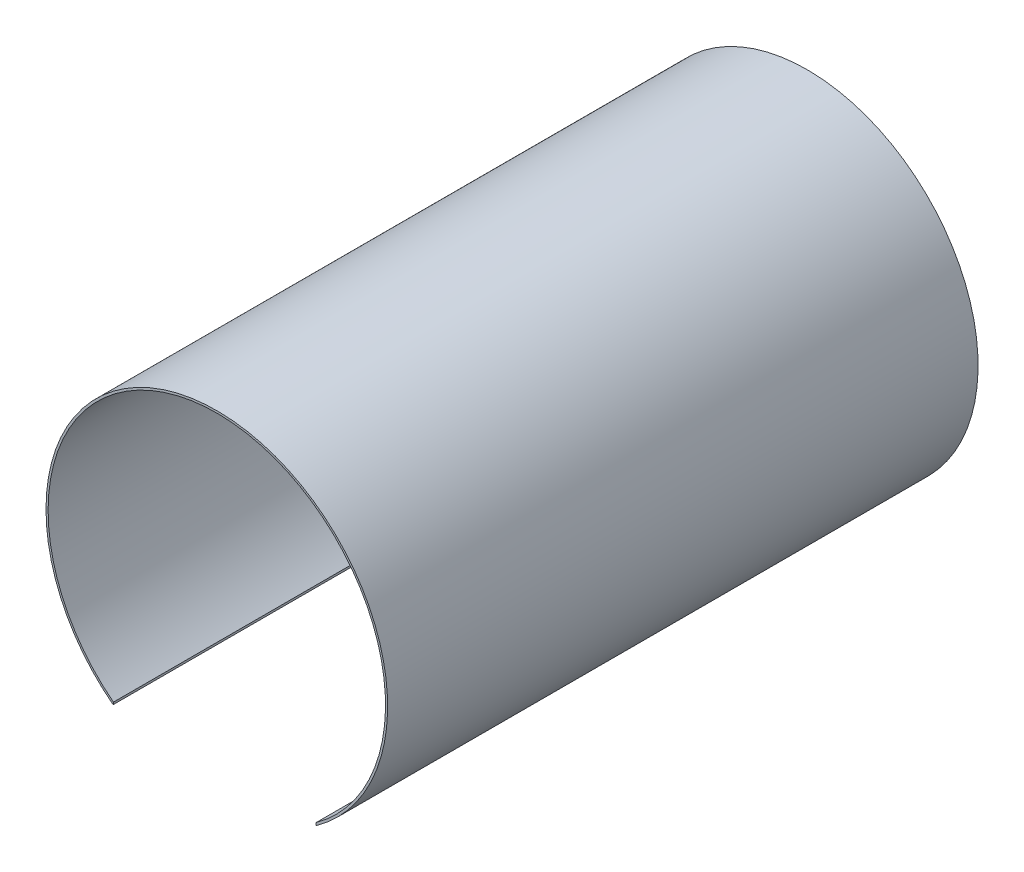
ISO-10303-21;
HEADER;
FILE_DESCRIPTION(('STEP AP214'),'2;1');
FILE_NAME('part.step','',(''),(''),'','','');
FILE_SCHEMA(('AUTOMOTIVE_DESIGN { 1 0 10303 214 1 1 1 1 }'));
ENDSEC;
DATA;
#1=APPLICATION_CONTEXT('core data for automotive mechanical design processes');
#2=APPLICATION_PROTOCOL_DEFINITION('international standard','automotive_design',2000,#1);
#3=PRODUCT_CONTEXT('',#1,'mechanical');
#4=PRODUCT('Part','Part','',(#3));
#5=PRODUCT_RELATED_PRODUCT_CATEGORY('part','',(#4));
#6=PRODUCT_DEFINITION_FORMATION('','',#4);
#7=PRODUCT_DEFINITION_CONTEXT('part definition',#1,'design');
#8=PRODUCT_DEFINITION('design','',#6,#7);
#9=PRODUCT_DEFINITION_SHAPE('','',#8);
#10=(LENGTH_UNIT() NAMED_UNIT(*) SI_UNIT(.MILLI.,.METRE.));
#11=(NAMED_UNIT(*) PLANE_ANGLE_UNIT() SI_UNIT($,.RADIAN.));
#12=(NAMED_UNIT(*) SI_UNIT($,.STERADIAN.) SOLID_ANGLE_UNIT());
#13=UNCERTAINTY_MEASURE_WITH_UNIT(LENGTH_MEASURE(1.E-05),#10,'distance_accuracy_value','');
#14=(GEOMETRIC_REPRESENTATION_CONTEXT(3) GLOBAL_UNCERTAINTY_ASSIGNED_CONTEXT((#13)) GLOBAL_UNIT_ASSIGNED_CONTEXT((#10,
#11,#12)) REPRESENTATION_CONTEXT('',''));
#15=CARTESIAN_POINT('',(0.,0.,0.));
#16=DIRECTION('',(0.,0.,1.));
#17=DIRECTION('',(1.,0.,0.));
#18=AXIS2_PLACEMENT_3D('',#15,#16,#17);
#19=CARTESIAN_POINT('',(-155.673978490936,-203.916457584703,889.));
#20=DIRECTION('',(0.0158653266215228,0.999874137784948,0.));
#21=DIRECTION('',(-0.999874137784948,0.0158653266215228,0.));
#22=AXIS2_PLACEMENT_3D('',#19,#20,#21);
#23=PLANE('',#22);
#24=DIRECTION('',(0.999874137784948,-0.0158653266215228,0.));
#25=VECTOR('',#24,1.);
#26=CARTESIAN_POINT('',(-155.673978490936,-203.916457584703,889.));
#27=LINE('',#26,#25);
#28=CARTESIAN_POINT('',(149.126021509064,-208.75281785396,889.));
#29=VERTEX_POINT('',#28);
#30=CARTESIAN_POINT('',(150.180738454338,-208.769553389161,889.));
#31=VERTEX_POINT('',#30);
#32=EDGE_CURVE('E62',#29,#31,#27,.T.);
#33=ORIENTED_EDGE('',*,*,#32,.F.);
#34=DIRECTION('',(0.,0.,-1.));
#35=VECTOR('',#34,1.);
#36=CARTESIAN_POINT('',(149.126021509064,-208.75281785396,889.));
#37=LINE('',#36,#35);
#38=CARTESIAN_POINT('',(149.126021509064,-208.75281785396,0.));
#39=VERTEX_POINT('',#38);
#40=EDGE_CURVE('E122',#29,#39,#37,.T.);
#41=ORIENTED_EDGE('',*,*,#40,.T.);
#42=DIRECTION('',(0.999874137784948,-0.0158653266215228,0.));
#43=VECTOR('',#42,1.);
#44=CARTESIAN_POINT('',(-155.673978490936,-203.916457584703,0.));
#45=LINE('',#44,#43);
#46=CARTESIAN_POINT('',(150.180738454338,-208.769553389161,0.));
#47=VERTEX_POINT('',#46);
#48=EDGE_CURVE('E117',#39,#47,#45,.T.);
#49=ORIENTED_EDGE('',*,*,#48,.T.);
#50=DIRECTION('',(0.,0.,-1.));
#51=VECTOR('',#50,1.);
#52=CARTESIAN_POINT('',(150.180738454338,-208.769553389161,889.));
#53=LINE('',#52,#51);
#54=EDGE_CURVE('E54',#31,#47,#53,.T.);
#55=ORIENTED_EDGE('',*,*,#54,.F.);
#56=EDGE_LOOP('',(#33,#41,#49,#55));
#57=FACE_BOUND('',#56,.T.);
#58=ADVANCED_FACE('F45',(#57),#23,.F.);
#59=CARTESIAN_POINT('',(0.,0.,889.));
#60=DIRECTION('',(0.,0.,1.));
#61=DIRECTION('',(1.,0.,0.));
#62=AXIS2_PLACEMENT_3D('',#59,#60,#61);
#63=PLANE('',#62);
#64=DIRECTION('',(0.0158653266215228,0.999874137784948,0.));
#65=VECTOR('',#64,1.);
#66=CARTESIAN_POINT('',(149.023486570995,-215.214836269358,889.));
#67=LINE('',#66,#65);
#68=CARTESIAN_POINT('',(149.176393921088,-205.578217466492,889.));
#69=VERTEX_POINT('',#68);
#70=EDGE_CURVE('E82',#29,#69,#67,.T.);
#71=ORIENTED_EDGE('',*,*,#70,.F.);
#72=ORIENTED_EDGE('',*,*,#32,.T.);
#73=CARTESIAN_POINT('',(0.,0.,889.));
#74=DIRECTION('',(0.,0.,1.));
#75=DIRECTION('',(1.,0.,0.));
#76=AXIS2_PLACEMENT_3D('',#73,#74,#75);
#77=CIRCLE('',#76,257.175);
#78=CARTESIAN_POINT('',(-156.728695436209,-203.899722049502,889.));
#79=VERTEX_POINT('',#78);
#80=EDGE_CURVE('E130',#31,#79,#77,.T.);
#81=ORIENTED_EDGE('',*,*,#80,.T.);
#82=CARTESIAN_POINT('',(-155.673978490936,-203.916457584703,889.));
#83=VERTEX_POINT('',#82);
#84=EDGE_CURVE('E132',#79,#83,#27,.T.);
#85=ORIENTED_EDGE('',*,*,#84,.T.);
#86=DIRECTION('',(0.0158653266215228,0.999874137784948,0.));
#87=VECTOR('',#86,1.);
#88=CARTESIAN_POINT('',(-155.776513429005,-210.378476000102,889.));
#89=LINE('',#88,#87);
#90=CARTESIAN_POINT('',(-155.623606078912,-200.741857197236,889.));
#91=VERTEX_POINT('',#90);
#92=EDGE_CURVE('E144',#83,#91,#89,.T.);
#93=ORIENTED_EDGE('',*,*,#92,.T.);
#94=CARTESIAN_POINT('',(0.,0.,889.));
#95=DIRECTION('',(0.,0.,1.));
#96=DIRECTION('',(1.,0.,0.));
#97=AXIS2_PLACEMENT_3D('',#94,#95,#96);
#98=CIRCLE('',#97,254.);
#99=EDGE_CURVE('E111',#69,#91,#98,.T.);
#100=ORIENTED_EDGE('',*,*,#99,.F.);
#101=EDGE_LOOP('',(#71,#72,#81,#85,#93,#100));
#102=FACE_BOUND('',#101,.T.);
#103=ADVANCED_FACE('F142',(#102),#63,.T.);
#104=CARTESIAN_POINT('',(0.,0.,0.));
#105=DIRECTION('',(0.,0.,1.));
#106=DIRECTION('',(1.,0.,0.));
#107=AXIS2_PLACEMENT_3D('',#104,#105,#106);
#108=PLANE('',#107);
#109=ORIENTED_EDGE('',*,*,#48,.F.);
#110=DIRECTION('',(0.0158653266215228,0.999874137784948,0.));
#111=VECTOR('',#110,1.);
#112=CARTESIAN_POINT('',(149.023486570995,-215.214836269358,0.));
#113=LINE('',#112,#111);
#114=CARTESIAN_POINT('',(149.176393921088,-205.578217466493,0.));
#115=VERTEX_POINT('',#114);
#116=EDGE_CURVE('E104',#39,#115,#113,.T.);
#117=ORIENTED_EDGE('',*,*,#116,.T.);
#118=CARTESIAN_POINT('',(0.,0.,0.));
#119=DIRECTION('',(0.,0.,1.));
#120=DIRECTION('',(1.,0.,0.));
#121=AXIS2_PLACEMENT_3D('',#118,#119,#120);
#122=CIRCLE('',#121,254.);
#123=CARTESIAN_POINT('',(-155.623606078912,-200.741857197236,0.));
#124=VERTEX_POINT('',#123);
#125=EDGE_CURVE('E116',#115,#124,#122,.T.);
#126=ORIENTED_EDGE('',*,*,#125,.T.);
#127=DIRECTION('',(0.0158653266215228,0.999874137784948,0.));
#128=VECTOR('',#127,1.);
#129=CARTESIAN_POINT('',(-155.776513429005,-210.378476000102,0.));
#130=LINE('',#129,#128);
#131=CARTESIAN_POINT('',(-155.673978490936,-203.916457584703,0.));
#132=VERTEX_POINT('',#131);
#133=EDGE_CURVE('E118',#132,#124,#130,.T.);
#134=ORIENTED_EDGE('',*,*,#133,.F.);
#135=CARTESIAN_POINT('',(-156.728695436209,-203.899722049502,0.));
#136=VERTEX_POINT('',#135);
#137=EDGE_CURVE('E74',#136,#132,#45,.T.);
#138=ORIENTED_EDGE('',*,*,#137,.F.);
#139=CARTESIAN_POINT('',(0.,0.,0.));
#140=DIRECTION('',(0.,0.,1.));
#141=DIRECTION('',(1.,0.,0.));
#142=AXIS2_PLACEMENT_3D('',#139,#140,#141);
#143=CIRCLE('',#142,257.175);
#144=EDGE_CURVE('E129',#47,#136,#143,.T.);
#145=ORIENTED_EDGE('',*,*,#144,.F.);
#146=EDGE_LOOP('',(#109,#117,#126,#134,#138,#145));
#147=FACE_BOUND('',#146,.T.);
#148=ADVANCED_FACE('F115',(#147),#108,.F.);
#149=CARTESIAN_POINT('',(0.,0.,889.));
#150=DIRECTION('',(0.,0.,-1.));
#151=DIRECTION('',(-1.,0.,0.));
#152=AXIS2_PLACEMENT_3D('',#149,#150,#151);
#153=CYLINDRICAL_SURFACE('',#152,257.175);
#154=ORIENTED_EDGE('',*,*,#144,.T.);
#155=DIRECTION('',(0.,0.,-1.));
#156=VECTOR('',#155,1.);
#157=CARTESIAN_POINT('',(-156.728695436209,-203.899722049502,889.));
#158=LINE('',#157,#156);
#159=EDGE_CURVE('E12',#79,#136,#158,.T.);
#160=ORIENTED_EDGE('',*,*,#159,.F.);
#161=ORIENTED_EDGE('',*,*,#80,.F.);
#162=ORIENTED_EDGE('',*,*,#54,.T.);
#163=EDGE_LOOP('',(#154,#160,#161,#162));
#164=FACE_BOUND('',#163,.T.);
#165=ADVANCED_FACE('F47',(#164),#153,.T.);
#166=ORIENTED_EDGE('',*,*,#137,.T.);
#167=DIRECTION('',(0.,0.,1.));
#168=VECTOR('',#167,1.);
#169=CARTESIAN_POINT('',(-155.673978490936,-203.916457584703,889.));
#170=LINE('',#169,#168);
#171=EDGE_CURVE('E125',#132,#83,#170,.T.);
#172=ORIENTED_EDGE('',*,*,#171,.T.);
#173=ORIENTED_EDGE('',*,*,#84,.F.);
#174=ORIENTED_EDGE('',*,*,#159,.T.);
#175=EDGE_LOOP('',(#166,#172,#173,#174));
#176=FACE_BOUND('',#175,.T.);
#177=ADVANCED_FACE('F153',(#176),#23,.F.);
#178=CARTESIAN_POINT('',(0.,0.,889.));
#179=DIRECTION('',(0.,0.,-1.));
#180=DIRECTION('',(-1.,0.,0.));
#181=AXIS2_PLACEMENT_3D('',#178,#179,#180);
#182=CYLINDRICAL_SURFACE('',#181,254.);
#183=ORIENTED_EDGE('',*,*,#125,.F.);
#184=DIRECTION('',(0.,0.,-1.));
#185=VECTOR('',#184,1.);
#186=CARTESIAN_POINT('',(149.176393921088,-205.578217466492,889.));
#187=LINE('',#186,#185);
#188=EDGE_CURVE('E101',#69,#115,#187,.T.);
#189=ORIENTED_EDGE('',*,*,#188,.F.);
#190=ORIENTED_EDGE('',*,*,#99,.T.);
#191=DIRECTION('',(0.,0.,-1.));
#192=VECTOR('',#191,1.);
#193=CARTESIAN_POINT('',(-155.623606078912,-200.741857197236,889.));
#194=LINE('',#193,#192);
#195=EDGE_CURVE('E110',#91,#124,#194,.T.);
#196=ORIENTED_EDGE('',*,*,#195,.T.);
#197=EDGE_LOOP('',(#183,#189,#190,#196));
#198=FACE_BOUND('',#197,.T.);
#199=ADVANCED_FACE('F121',(#198),#182,.F.);
#200=CARTESIAN_POINT('',(-155.776513429005,-210.378476000102,889.));
#201=DIRECTION('',(-0.999874137784948,0.0158653266215228,0.));
#202=DIRECTION('',(-0.0158653266215228,-0.999874137784948,0.));
#203=AXIS2_PLACEMENT_3D('',#200,#201,#202);
#204=PLANE('',#203);
#205=ORIENTED_EDGE('',*,*,#133,.T.);
#206=ORIENTED_EDGE('',*,*,#195,.F.);
#207=ORIENTED_EDGE('',*,*,#92,.F.);
#208=ORIENTED_EDGE('',*,*,#171,.F.);
#209=EDGE_LOOP('',(#205,#206,#207,#208));
#210=FACE_BOUND('',#209,.T.);
#211=ADVANCED_FACE('F151',(#210),#204,.F.);
#212=CARTESIAN_POINT('',(149.023486570995,-215.214836269358,889.));
#213=DIRECTION('',(0.999874137784948,-0.0158653266215228,0.));
#214=DIRECTION('',(0.0158653266215228,0.999874137784948,0.));
#215=AXIS2_PLACEMENT_3D('',#212,#213,#214);
#216=PLANE('',#215);
#217=ORIENTED_EDGE('',*,*,#70,.T.);
#218=ORIENTED_EDGE('',*,*,#188,.T.);
#219=ORIENTED_EDGE('',*,*,#116,.F.);
#220=ORIENTED_EDGE('',*,*,#40,.F.);
#221=EDGE_LOOP('',(#217,#218,#219,#220));
#222=FACE_BOUND('',#221,.T.);
#223=ADVANCED_FACE('F103',(#222),#216,.F.);
#224=CLOSED_SHELL('',(#58,#103,#148,#165,#177,#199,#211,#223));
#225=MANIFOLD_SOLID_BREP('B2',#224);
#226=ADVANCED_BREP_SHAPE_REPRESENTATION('',(#18,#225),#14);
#227=SHAPE_DEFINITION_REPRESENTATION(#9,#226);
ENDSEC;
END-ISO-10303-21;
